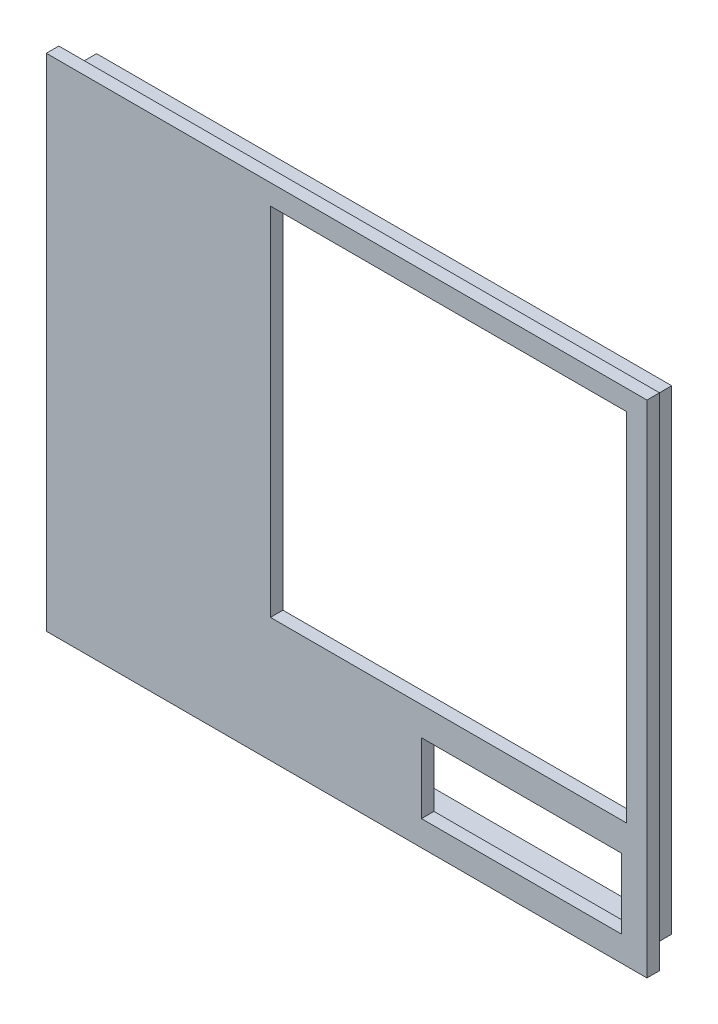
ISO-10303-21;
HEADER;
FILE_DESCRIPTION(('STEP AP214'),'2;1');
FILE_NAME('part.step','',(''),(''),'','','');
FILE_SCHEMA(('AUTOMOTIVE_DESIGN { 1 0 10303 214 1 1 1 1 }'));
ENDSEC;
DATA;
#1=APPLICATION_CONTEXT('core data for automotive mechanical design processes');
#2=APPLICATION_PROTOCOL_DEFINITION('international standard','automotive_design',2000,#1);
#3=PRODUCT_CONTEXT('',#1,'mechanical');
#4=PRODUCT('Part','Part','',(#3));
#5=PRODUCT_RELATED_PRODUCT_CATEGORY('part','',(#4));
#6=PRODUCT_DEFINITION_FORMATION('','',#4);
#7=PRODUCT_DEFINITION_CONTEXT('part definition',#1,'design');
#8=PRODUCT_DEFINITION('design','',#6,#7);
#9=PRODUCT_DEFINITION_SHAPE('','',#8);
#10=(LENGTH_UNIT() NAMED_UNIT(*) SI_UNIT(.MILLI.,.METRE.));
#11=(NAMED_UNIT(*) PLANE_ANGLE_UNIT() SI_UNIT($,.RADIAN.));
#12=(NAMED_UNIT(*) SI_UNIT($,.STERADIAN.) SOLID_ANGLE_UNIT());
#13=UNCERTAINTY_MEASURE_WITH_UNIT(LENGTH_MEASURE(1.E-05),#10,'distance_accuracy_value','');
#14=(GEOMETRIC_REPRESENTATION_CONTEXT(3) GLOBAL_UNCERTAINTY_ASSIGNED_CONTEXT((#13)) GLOBAL_UNIT_ASSIGNED_CONTEXT((#10,
#11,#12)) REPRESENTATION_CONTEXT('',''));
#15=CARTESIAN_POINT('',(0.,0.,0.));
#16=DIRECTION('',(0.,0.,1.));
#17=DIRECTION('',(1.,0.,0.));
#18=AXIS2_PLACEMENT_3D('',#15,#16,#17);
#19=CARTESIAN_POINT('',(60.,-50.,2.5));
#20=DIRECTION('',(-1.,0.,0.));
#21=DIRECTION('',(0.,0.,1.));
#22=AXIS2_PLACEMENT_3D('',#19,#20,#21);
#23=PLANE('',#22);
#24=DIRECTION('',(0.,1.,0.));
#25=VECTOR('',#24,1.);
#26=CARTESIAN_POINT('',(60.,-50.,0.));
#27=LINE('',#26,#25);
#28=CARTESIAN_POINT('',(60.,-50.,0.));
#29=VERTEX_POINT('',#28);
#30=CARTESIAN_POINT('',(60.,50.,0.));
#31=VERTEX_POINT('',#30);
#32=EDGE_CURVE('E291',#29,#31,#27,.T.);
#33=ORIENTED_EDGE('',*,*,#32,.T.);
#34=DIRECTION('',(0.,0.,-1.));
#35=VECTOR('',#34,1.);
#36=CARTESIAN_POINT('',(60.,50.,2.5));
#37=LINE('',#36,#35);
#38=CARTESIAN_POINT('',(60.,50.,2.5));
#39=VERTEX_POINT('',#38);
#40=EDGE_CURVE('E12',#39,#31,#37,.T.);
#41=ORIENTED_EDGE('',*,*,#40,.F.);
#42=DIRECTION('',(0.,1.,0.));
#43=VECTOR('',#42,1.);
#44=CARTESIAN_POINT('',(60.,-50.,2.5));
#45=LINE('',#44,#43);
#46=CARTESIAN_POINT('',(60.,-50.,2.5));
#47=VERTEX_POINT('',#46);
#48=EDGE_CURVE('E300',#47,#39,#45,.T.);
#49=ORIENTED_EDGE('',*,*,#48,.F.);
#50=DIRECTION('',(0.,0.,-1.));
#51=VECTOR('',#50,1.);
#52=CARTESIAN_POINT('',(60.,-50.,2.5));
#53=LINE('',#52,#51);
#54=EDGE_CURVE('E314',#47,#29,#53,.T.);
#55=ORIENTED_EDGE('',*,*,#54,.T.);
#56=EDGE_LOOP('',(#33,#41,#49,#55));
#57=FACE_BOUND('',#56,.T.);
#58=ADVANCED_FACE('F73',(#57),#23,.F.);
#59=CARTESIAN_POINT('',(-60.,50.,2.5));
#60=DIRECTION('',(0.,-1.,0.));
#61=DIRECTION('',(0.,0.,-1.));
#62=AXIS2_PLACEMENT_3D('',#59,#60,#61);
#63=PLANE('',#62);
#64=DIRECTION('',(-1.,0.,0.));
#65=VECTOR('',#64,1.);
#66=CARTESIAN_POINT('',(-60.,50.,0.));
#67=LINE('',#66,#65);
#68=CARTESIAN_POINT('',(-60.,50.,0.));
#69=VERTEX_POINT('',#68);
#70=EDGE_CURVE('E318',#31,#69,#67,.T.);
#71=ORIENTED_EDGE('',*,*,#70,.T.);
#72=DIRECTION('',(0.,0.,-1.));
#73=VECTOR('',#72,1.);
#74=CARTESIAN_POINT('',(-60.,50.,2.5));
#75=LINE('',#74,#73);
#76=CARTESIAN_POINT('',(-60.,50.,2.5));
#77=VERTEX_POINT('',#76);
#78=EDGE_CURVE('E81',#77,#69,#75,.T.);
#79=ORIENTED_EDGE('',*,*,#78,.F.);
#80=DIRECTION('',(-1.,0.,0.));
#81=VECTOR('',#80,1.);
#82=CARTESIAN_POINT('',(-60.,50.,2.5));
#83=LINE('',#82,#81);
#84=EDGE_CURVE('E304',#39,#77,#83,.T.);
#85=ORIENTED_EDGE('',*,*,#84,.F.);
#86=ORIENTED_EDGE('',*,*,#40,.T.);
#87=EDGE_LOOP('',(#71,#79,#85,#86));
#88=FACE_BOUND('',#87,.T.);
#89=ADVANCED_FACE('F354',(#88),#63,.F.);
#90=CARTESIAN_POINT('',(-60.,-50.,2.5));
#91=DIRECTION('',(1.,0.,0.));
#92=DIRECTION('',(0.,0.,-1.));
#93=AXIS2_PLACEMENT_3D('',#90,#91,#92);
#94=PLANE('',#93);
#95=DIRECTION('',(0.,-1.,0.));
#96=VECTOR('',#95,1.);
#97=CARTESIAN_POINT('',(-60.,-50.,0.));
#98=LINE('',#97,#96);
#99=CARTESIAN_POINT('',(-60.,-50.,0.));
#100=VERTEX_POINT('',#99);
#101=EDGE_CURVE('E321',#69,#100,#98,.T.);
#102=ORIENTED_EDGE('',*,*,#101,.T.);
#103=DIRECTION('',(0.,0.,-1.));
#104=VECTOR('',#103,1.);
#105=CARTESIAN_POINT('',(-60.,-50.,2.5));
#106=LINE('',#105,#104);
#107=CARTESIAN_POINT('',(-60.,-50.,2.5));
#108=VERTEX_POINT('',#107);
#109=EDGE_CURVE('E329',#108,#100,#106,.T.);
#110=ORIENTED_EDGE('',*,*,#109,.F.);
#111=DIRECTION('',(0.,-1.,0.));
#112=VECTOR('',#111,1.);
#113=CARTESIAN_POINT('',(-60.,-50.,2.5));
#114=LINE('',#113,#112);
#115=EDGE_CURVE('E308',#77,#108,#114,.T.);
#116=ORIENTED_EDGE('',*,*,#115,.F.);
#117=ORIENTED_EDGE('',*,*,#78,.T.);
#118=EDGE_LOOP('',(#102,#110,#116,#117));
#119=FACE_BOUND('',#118,.T.);
#120=ADVANCED_FACE('F338',(#119),#94,.F.);
#121=CARTESIAN_POINT('',(-60.,-50.,2.5));
#122=DIRECTION('',(0.,1.,0.));
#123=DIRECTION('',(0.,0.,1.));
#124=AXIS2_PLACEMENT_3D('',#121,#122,#123);
#125=PLANE('',#124);
#126=DIRECTION('',(1.,0.,0.));
#127=VECTOR('',#126,1.);
#128=CARTESIAN_POINT('',(-60.,-50.,0.));
#129=LINE('',#128,#127);
#130=EDGE_CURVE('E305',#100,#29,#129,.T.);
#131=ORIENTED_EDGE('',*,*,#130,.T.);
#132=ORIENTED_EDGE('',*,*,#54,.F.);
#133=DIRECTION('',(1.,0.,0.));
#134=VECTOR('',#133,1.);
#135=CARTESIAN_POINT('',(-60.,-50.,2.5));
#136=LINE('',#135,#134);
#137=EDGE_CURVE('E311',#108,#47,#136,.T.);
#138=ORIENTED_EDGE('',*,*,#137,.F.);
#139=ORIENTED_EDGE('',*,*,#109,.T.);
#140=EDGE_LOOP('',(#131,#132,#138,#139));
#141=FACE_BOUND('',#140,.T.);
#142=ADVANCED_FACE('F347',(#141),#125,.F.);
#143=CARTESIAN_POINT('',(0.,0.,2.5));
#144=DIRECTION('',(0.,0.,-1.));
#145=DIRECTION('',(-1.,0.,0.));
#146=AXIS2_PLACEMENT_3D('',#143,#144,#145);
#147=PLANE('',#146);
#148=DIRECTION('',(-1.,0.,0.));
#149=VECTOR('',#148,1.);
#150=CARTESIAN_POINT('',(55.95,45.95,2.5));
#151=LINE('',#150,#149);
#152=CARTESIAN_POINT('',(55.95,45.95,2.5));
#153=VERTEX_POINT('',#152);
#154=CARTESIAN_POINT('',(-15.22,45.95,2.5));
#155=VERTEX_POINT('',#154);
#156=EDGE_CURVE('E432',#153,#155,#151,.T.);
#157=ORIENTED_EDGE('',*,*,#156,.F.);
#158=DIRECTION('',(0.,1.,0.));
#159=VECTOR('',#158,1.);
#160=CARTESIAN_POINT('',(55.95,45.95,2.5));
#161=LINE('',#160,#159);
#162=CARTESIAN_POINT('',(55.95,-25.22,2.5));
#163=VERTEX_POINT('',#162);
#164=EDGE_CURVE('E435',#163,#153,#161,.T.);
#165=ORIENTED_EDGE('',*,*,#164,.F.);
#166=DIRECTION('',(1.,0.,0.));
#167=VECTOR('',#166,1.);
#168=CARTESIAN_POINT('',(55.95,-25.22,2.5));
#169=LINE('',#168,#167);
#170=CARTESIAN_POINT('',(-15.22,-25.22,2.5));
#171=VERTEX_POINT('',#170);
#172=EDGE_CURVE('E207',#171,#163,#169,.T.);
#173=ORIENTED_EDGE('',*,*,#172,.F.);
#174=DIRECTION('',(0.,-1.,0.));
#175=VECTOR('',#174,1.);
#176=CARTESIAN_POINT('',(-15.22,45.95,2.5));
#177=LINE('',#176,#175);
#178=EDGE_CURVE('E428',#155,#171,#177,.T.);
#179=ORIENTED_EDGE('',*,*,#178,.F.);
#180=EDGE_LOOP('',(#157,#165,#173,#179));
#181=FACE_BOUND('',#180,.T.);
#182=DIRECTION('',(1.,0.,0.));
#183=VECTOR('',#182,1.);
#184=CARTESIAN_POINT('',(54.95,-44.95,2.5));
#185=LINE('',#184,#183);
#186=CARTESIAN_POINT('',(14.95,-44.95,2.5));
#187=VERTEX_POINT('',#186);
#188=CARTESIAN_POINT('',(54.95,-44.95,2.5));
#189=VERTEX_POINT('',#188);
#190=EDGE_CURVE('E477',#187,#189,#185,.T.);
#191=ORIENTED_EDGE('',*,*,#190,.F.);
#192=DIRECTION('',(0.,-1.,0.));
#193=VECTOR('',#192,1.);
#194=CARTESIAN_POINT('',(14.95,-44.95,2.5));
#195=LINE('',#194,#193);
#196=CARTESIAN_POINT('',(14.95,-30.95,2.5));
#197=VERTEX_POINT('',#196);
#198=EDGE_CURVE('E448',#197,#187,#195,.T.);
#199=ORIENTED_EDGE('',*,*,#198,.F.);
#200=DIRECTION('',(-1.,0.,0.));
#201=VECTOR('',#200,1.);
#202=CARTESIAN_POINT('',(54.95,-30.95,2.5));
#203=LINE('',#202,#201);
#204=CARTESIAN_POINT('',(54.95,-30.95,2.5));
#205=VERTEX_POINT('',#204);
#206=EDGE_CURVE('E445',#205,#197,#203,.T.);
#207=ORIENTED_EDGE('',*,*,#206,.F.);
#208=DIRECTION('',(0.,1.,0.));
#209=VECTOR('',#208,1.);
#210=CARTESIAN_POINT('',(54.95,-44.95,2.5));
#211=LINE('',#210,#209);
#212=EDGE_CURVE('E462',#189,#205,#211,.T.);
#213=ORIENTED_EDGE('',*,*,#212,.F.);
#214=EDGE_LOOP('',(#191,#199,#207,#213));
#215=FACE_BOUND('',#214,.T.);
#216=ORIENTED_EDGE('',*,*,#48,.T.);
#217=ORIENTED_EDGE('',*,*,#84,.T.);
#218=ORIENTED_EDGE('',*,*,#115,.T.);
#219=ORIENTED_EDGE('',*,*,#137,.T.);
#220=EDGE_LOOP('',(#216,#217,#218,#219));
#221=FACE_BOUND('',#220,.T.);
#222=ADVANCED_FACE('F353',(#181,#215,#221),#147,.F.);
#223=CARTESIAN_POINT('',(0.,0.,0.));
#224=DIRECTION('',(0.,0.,-1.));
#225=DIRECTION('',(-1.,0.,0.));
#226=AXIS2_PLACEMENT_3D('',#223,#224,#225);
#227=PLANE('',#226);
#228=DIRECTION('',(-1.,0.,0.));
#229=VECTOR('',#228,1.);
#230=CARTESIAN_POINT('',(57.45,47.45,0.));
#231=LINE('',#230,#229);
#232=CARTESIAN_POINT('',(57.45,47.45,0.));
#233=VERTEX_POINT('',#232);
#234=CARTESIAN_POINT('',(-57.45,47.45,0.));
#235=VERTEX_POINT('',#234);
#236=EDGE_CURVE('E246',#233,#235,#231,.T.);
#237=ORIENTED_EDGE('',*,*,#236,.T.);
#238=DIRECTION('',(0.,1.,0.));
#239=VECTOR('',#238,1.);
#240=CARTESIAN_POINT('',(-57.45,-47.45,0.));
#241=LINE('',#240,#239);
#242=CARTESIAN_POINT('',(-57.45,-47.45,0.));
#243=VERTEX_POINT('',#242);
#244=EDGE_CURVE('E277',#243,#235,#241,.T.);
#245=ORIENTED_EDGE('',*,*,#244,.F.);
#246=DIRECTION('',(-1.,0.,0.));
#247=VECTOR('',#246,1.);
#248=CARTESIAN_POINT('',(57.45,-47.45,0.));
#249=LINE('',#248,#247);
#250=CARTESIAN_POINT('',(57.45,-47.45,0.));
#251=VERTEX_POINT('',#250);
#252=EDGE_CURVE('E281',#251,#243,#249,.T.);
#253=ORIENTED_EDGE('',*,*,#252,.F.);
#254=DIRECTION('',(0.,1.,0.));
#255=VECTOR('',#254,1.);
#256=CARTESIAN_POINT('',(57.45,-47.45,0.));
#257=LINE('',#256,#255);
#258=EDGE_CURVE('E263',#251,#233,#257,.T.);
#259=ORIENTED_EDGE('',*,*,#258,.T.);
#260=EDGE_LOOP('',(#237,#245,#253,#259));
#261=FACE_BOUND('',#260,.T.);
#262=ORIENTED_EDGE('',*,*,#32,.F.);
#263=ORIENTED_EDGE('',*,*,#130,.F.);
#264=ORIENTED_EDGE('',*,*,#101,.F.);
#265=ORIENTED_EDGE('',*,*,#70,.F.);
#266=EDGE_LOOP('',(#262,#263,#264,#265));
#267=FACE_BOUND('',#266,.T.);
#268=ADVANCED_FACE('F344',(#261,#267),#227,.T.);
#269=CARTESIAN_POINT('',(57.45,47.45,-5.));
#270=DIRECTION('',(0.,1.,0.));
#271=DIRECTION('',(0.,0.,1.));
#272=AXIS2_PLACEMENT_3D('',#269,#270,#271);
#273=PLANE('',#272);
#274=ORIENTED_EDGE('',*,*,#236,.F.);
#275=DIRECTION('',(0.,0.,1.));
#276=VECTOR('',#275,1.);
#277=CARTESIAN_POINT('',(57.45,47.45,-5.));
#278=LINE('',#277,#276);
#279=CARTESIAN_POINT('',(57.45,47.45,-5.));
#280=VERTEX_POINT('',#279);
#281=EDGE_CURVE('E288',#280,#233,#278,.T.);
#282=ORIENTED_EDGE('',*,*,#281,.F.);
#283=DIRECTION('',(-1.,0.,0.));
#284=VECTOR('',#283,1.);
#285=CARTESIAN_POINT('',(57.45,47.45,-5.));
#286=LINE('',#285,#284);
#287=CARTESIAN_POINT('',(-57.45,47.45,-5.));
#288=VERTEX_POINT('',#287);
#289=EDGE_CURVE('E258',#280,#288,#286,.T.);
#290=ORIENTED_EDGE('',*,*,#289,.T.);
#291=DIRECTION('',(0.,0.,1.));
#292=VECTOR('',#291,1.);
#293=CARTESIAN_POINT('',(-57.45,47.45,-5.));
#294=LINE('',#293,#292);
#295=EDGE_CURVE('E273',#288,#235,#294,.T.);
#296=ORIENTED_EDGE('',*,*,#295,.T.);
#297=EDGE_LOOP('',(#274,#282,#290,#296));
#298=FACE_BOUND('',#297,.T.);
#299=ADVANCED_FACE('F366',(#298),#273,.T.);
#300=CARTESIAN_POINT('',(57.45,-47.45,-5.));
#301=DIRECTION('',(1.,0.,0.));
#302=DIRECTION('',(0.,0.,-1.));
#303=AXIS2_PLACEMENT_3D('',#300,#301,#302);
#304=PLANE('',#303);
#305=ORIENTED_EDGE('',*,*,#258,.F.);
#306=DIRECTION('',(0.,0.,1.));
#307=VECTOR('',#306,1.);
#308=CARTESIAN_POINT('',(57.45,-47.45,-5.));
#309=LINE('',#308,#307);
#310=CARTESIAN_POINT('',(57.45,-47.45,-5.));
#311=VERTEX_POINT('',#310);
#312=EDGE_CURVE('E292',#311,#251,#309,.T.);
#313=ORIENTED_EDGE('',*,*,#312,.F.);
#314=DIRECTION('',(0.,1.,0.));
#315=VECTOR('',#314,1.);
#316=CARTESIAN_POINT('',(57.45,-47.45,-5.));
#317=LINE('',#316,#315);
#318=EDGE_CURVE('E269',#311,#280,#317,.T.);
#319=ORIENTED_EDGE('',*,*,#318,.T.);
#320=ORIENTED_EDGE('',*,*,#281,.T.);
#321=EDGE_LOOP('',(#305,#313,#319,#320));
#322=FACE_BOUND('',#321,.T.);
#323=ADVANCED_FACE('F373',(#322),#304,.T.);
#324=CARTESIAN_POINT('',(57.45,-47.45,-5.));
#325=DIRECTION('',(0.,1.,0.));
#326=DIRECTION('',(0.,0.,1.));
#327=AXIS2_PLACEMENT_3D('',#324,#325,#326);
#328=PLANE('',#327);
#329=ORIENTED_EDGE('',*,*,#252,.T.);
#330=DIRECTION('',(0.,0.,1.));
#331=VECTOR('',#330,1.);
#332=CARTESIAN_POINT('',(-57.45,-47.45,-5.));
#333=LINE('',#332,#331);
#334=CARTESIAN_POINT('',(-57.45,-47.45,-5.));
#335=VERTEX_POINT('',#334);
#336=EDGE_CURVE('E295',#335,#243,#333,.T.);
#337=ORIENTED_EDGE('',*,*,#336,.F.);
#338=DIRECTION('',(-1.,0.,0.));
#339=VECTOR('',#338,1.);
#340=CARTESIAN_POINT('',(57.45,-47.45,-5.));
#341=LINE('',#340,#339);
#342=EDGE_CURVE('E266',#311,#335,#341,.T.);
#343=ORIENTED_EDGE('',*,*,#342,.F.);
#344=ORIENTED_EDGE('',*,*,#312,.T.);
#345=EDGE_LOOP('',(#329,#337,#343,#344));
#346=FACE_BOUND('',#345,.T.);
#347=ADVANCED_FACE('F379',(#346),#328,.F.);
#348=CARTESIAN_POINT('',(-57.45,-47.45,-5.));
#349=DIRECTION('',(1.,0.,0.));
#350=DIRECTION('',(0.,0.,-1.));
#351=AXIS2_PLACEMENT_3D('',#348,#349,#350);
#352=PLANE('',#351);
#353=ORIENTED_EDGE('',*,*,#244,.T.);
#354=ORIENTED_EDGE('',*,*,#295,.F.);
#355=DIRECTION('',(0.,1.,0.));
#356=VECTOR('',#355,1.);
#357=CARTESIAN_POINT('',(-57.45,-47.45,-5.));
#358=LINE('',#357,#356);
#359=EDGE_CURVE('E262',#335,#288,#358,.T.);
#360=ORIENTED_EDGE('',*,*,#359,.F.);
#361=ORIENTED_EDGE('',*,*,#336,.T.);
#362=EDGE_LOOP('',(#353,#354,#360,#361));
#363=FACE_BOUND('',#362,.T.);
#364=ADVANCED_FACE('F375',(#363),#352,.F.);
#365=CARTESIAN_POINT('',(0.,0.,-5.));
#366=DIRECTION('',(0.,0.,-1.));
#367=DIRECTION('',(-1.,0.,0.));
#368=AXIS2_PLACEMENT_3D('',#365,#366,#367);
#369=PLANE('',#368);
#370=DIRECTION('',(-1.,0.,0.));
#371=VECTOR('',#370,1.);
#372=CARTESIAN_POINT('',(55.95,45.95,-5.));
#373=LINE('',#372,#371);
#374=CARTESIAN_POINT('',(55.95,45.95,-5.));
#375=VERTEX_POINT('',#374);
#376=CARTESIAN_POINT('',(-55.95,45.95,-5.));
#377=VERTEX_POINT('',#376);
#378=EDGE_CURVE('E231',#375,#377,#373,.T.);
#379=ORIENTED_EDGE('',*,*,#378,.T.);
#380=DIRECTION('',(0.,1.,0.));
#381=VECTOR('',#380,1.);
#382=CARTESIAN_POINT('',(-55.95,-45.95,-5.));
#383=LINE('',#382,#381);
#384=CARTESIAN_POINT('',(-55.95,-45.95,-5.));
#385=VERTEX_POINT('',#384);
#386=EDGE_CURVE('E237',#385,#377,#383,.T.);
#387=ORIENTED_EDGE('',*,*,#386,.F.);
#388=DIRECTION('',(-1.,0.,0.));
#389=VECTOR('',#388,1.);
#390=CARTESIAN_POINT('',(55.95,-45.95,-5.));
#391=LINE('',#390,#389);
#392=CARTESIAN_POINT('',(55.95,-45.95,-5.));
#393=VERTEX_POINT('',#392);
#394=EDGE_CURVE('E484',#393,#385,#391,.T.);
#395=ORIENTED_EDGE('',*,*,#394,.F.);
#396=DIRECTION('',(0.,1.,0.));
#397=VECTOR('',#396,1.);
#398=CARTESIAN_POINT('',(55.95,-45.95,-5.));
#399=LINE('',#398,#397);
#400=EDGE_CURVE('E257',#393,#375,#399,.T.);
#401=ORIENTED_EDGE('',*,*,#400,.T.);
#402=EDGE_LOOP('',(#379,#387,#395,#401));
#403=FACE_BOUND('',#402,.T.);
#404=ORIENTED_EDGE('',*,*,#289,.F.);
#405=ORIENTED_EDGE('',*,*,#318,.F.);
#406=ORIENTED_EDGE('',*,*,#342,.T.);
#407=ORIENTED_EDGE('',*,*,#359,.T.);
#408=EDGE_LOOP('',(#404,#405,#406,#407));
#409=FACE_BOUND('',#408,.T.);
#410=ADVANCED_FACE('F378',(#403,#409),#369,.T.);
#411=CARTESIAN_POINT('',(55.95,45.95,-5.));
#412=DIRECTION('',(0.,1.,0.));
#413=DIRECTION('',(0.,0.,1.));
#414=AXIS2_PLACEMENT_3D('',#411,#412,#413);
#415=PLANE('',#414);
#416=DIRECTION('',(0.,0.,1.));
#417=VECTOR('',#416,1.);
#418=CARTESIAN_POINT('',(55.95,45.95,-5.));
#419=LINE('',#418,#417);
#420=EDGE_CURVE('E243',#375,#153,#419,.T.);
#421=ORIENTED_EDGE('',*,*,#420,.T.);
#422=ORIENTED_EDGE('',*,*,#156,.T.);
#423=DIRECTION('',(0.,0.,-1.));
#424=VECTOR('',#423,1.);
#425=CARTESIAN_POINT('',(-15.22,45.95,103.149579234093));
#426=LINE('',#425,#424);
#427=CARTESIAN_POINT('',(-15.22,45.95,0.));
#428=VERTEX_POINT('',#427);
#429=EDGE_CURVE('E429',#155,#428,#426,.T.);
#430=ORIENTED_EDGE('',*,*,#429,.T.);
#431=DIRECTION('',(-1.,0.,0.));
#432=VECTOR('',#431,1.);
#433=CARTESIAN_POINT('',(55.95,45.95,0.));
#434=LINE('',#433,#432);
#435=CARTESIAN_POINT('',(-55.95,45.95,0.));
#436=VERTEX_POINT('',#435);
#437=EDGE_CURVE('E437',#428,#436,#434,.T.);
#438=ORIENTED_EDGE('',*,*,#437,.T.);
#439=DIRECTION('',(0.,0.,1.));
#440=VECTOR('',#439,1.);
#441=CARTESIAN_POINT('',(-55.95,45.95,-5.));
#442=LINE('',#441,#440);
#443=EDGE_CURVE('E253',#377,#436,#442,.T.);
#444=ORIENTED_EDGE('',*,*,#443,.F.);
#445=ORIENTED_EDGE('',*,*,#378,.F.);
#446=EDGE_LOOP('',(#421,#422,#430,#438,#444,#445));
#447=FACE_BOUND('',#446,.T.);
#448=ADVANCED_FACE('F389',(#447),#415,.F.);
#449=CARTESIAN_POINT('',(55.95,-45.95,-5.));
#450=DIRECTION('',(1.,0.,0.));
#451=DIRECTION('',(0.,0.,-1.));
#452=AXIS2_PLACEMENT_3D('',#449,#450,#451);
#453=PLANE('',#452);
#454=DIRECTION('',(0.,1.,0.));
#455=VECTOR('',#454,1.);
#456=CARTESIAN_POINT('',(55.95,-45.95,0.));
#457=LINE('',#456,#455);
#458=CARTESIAN_POINT('',(55.95,-45.95,0.));
#459=VERTEX_POINT('',#458);
#460=CARTESIAN_POINT('',(55.95,-25.22,0.));
#461=VERTEX_POINT('',#460);
#462=EDGE_CURVE('E219',#459,#461,#457,.T.);
#463=ORIENTED_EDGE('',*,*,#462,.T.);
#464=DIRECTION('',(0.,0.,-1.));
#465=VECTOR('',#464,1.);
#466=CARTESIAN_POINT('',(55.95,-25.22,103.149579234093));
#467=LINE('',#466,#465);
#468=EDGE_CURVE('E202',#163,#461,#467,.T.);
#469=ORIENTED_EDGE('',*,*,#468,.F.);
#470=ORIENTED_EDGE('',*,*,#164,.T.);
#471=ORIENTED_EDGE('',*,*,#420,.F.);
#472=ORIENTED_EDGE('',*,*,#400,.F.);
#473=DIRECTION('',(0.,0.,1.));
#474=VECTOR('',#473,1.);
#475=CARTESIAN_POINT('',(55.95,-45.95,-5.));
#476=LINE('',#475,#474);
#477=EDGE_CURVE('E228',#393,#459,#476,.T.);
#478=ORIENTED_EDGE('',*,*,#477,.T.);
#479=EDGE_LOOP('',(#463,#469,#470,#471,#472,#478));
#480=FACE_BOUND('',#479,.T.);
#481=ADVANCED_FACE('F226',(#480),#453,.F.);
#482=CARTESIAN_POINT('',(55.95,-45.95,-5.));
#483=DIRECTION('',(0.,1.,0.));
#484=DIRECTION('',(0.,0.,1.));
#485=AXIS2_PLACEMENT_3D('',#482,#483,#484);
#486=PLANE('',#485);
#487=DIRECTION('',(-1.,0.,0.));
#488=VECTOR('',#487,1.);
#489=CARTESIAN_POINT('',(55.95,-45.95,0.));
#490=LINE('',#489,#488);
#491=CARTESIAN_POINT('',(-55.95,-45.95,0.));
#492=VERTEX_POINT('',#491);
#493=EDGE_CURVE('E232',#459,#492,#490,.T.);
#494=ORIENTED_EDGE('',*,*,#493,.F.);
#495=ORIENTED_EDGE('',*,*,#477,.F.);
#496=ORIENTED_EDGE('',*,*,#394,.T.);
#497=DIRECTION('',(0.,0.,1.));
#498=VECTOR('',#497,1.);
#499=CARTESIAN_POINT('',(-55.95,-45.95,-5.));
#500=LINE('',#499,#498);
#501=EDGE_CURVE('E249',#385,#492,#500,.T.);
#502=ORIENTED_EDGE('',*,*,#501,.T.);
#503=EDGE_LOOP('',(#494,#495,#496,#502));
#504=FACE_BOUND('',#503,.T.);
#505=ADVANCED_FACE('F397',(#504),#486,.T.);
#506=CARTESIAN_POINT('',(-55.95,-45.95,-5.));
#507=DIRECTION('',(1.,0.,0.));
#508=DIRECTION('',(0.,0.,-1.));
#509=AXIS2_PLACEMENT_3D('',#506,#507,#508);
#510=PLANE('',#509);
#511=DIRECTION('',(0.,1.,0.));
#512=VECTOR('',#511,1.);
#513=CARTESIAN_POINT('',(-55.95,-45.95,0.));
#514=LINE('',#513,#512);
#515=EDGE_CURVE('E239',#492,#436,#514,.T.);
#516=ORIENTED_EDGE('',*,*,#515,.F.);
#517=ORIENTED_EDGE('',*,*,#501,.F.);
#518=ORIENTED_EDGE('',*,*,#386,.T.);
#519=ORIENTED_EDGE('',*,*,#443,.T.);
#520=EDGE_LOOP('',(#516,#517,#518,#519));
#521=FACE_BOUND('',#520,.T.);
#522=ADVANCED_FACE('F394',(#521),#510,.T.);
#523=DIRECTION('',(-1.,0.,0.));
#524=VECTOR('',#523,1.);
#525=CARTESIAN_POINT('',(55.95,-25.22,0.));
#526=LINE('',#525,#524);
#527=CARTESIAN_POINT('',(-15.22,-25.22,0.));
#528=VERTEX_POINT('',#527);
#529=EDGE_CURVE('E205',#461,#528,#526,.T.);
#530=ORIENTED_EDGE('',*,*,#529,.F.);
#531=ORIENTED_EDGE('',*,*,#462,.F.);
#532=ORIENTED_EDGE('',*,*,#493,.T.);
#533=ORIENTED_EDGE('',*,*,#515,.T.);
#534=ORIENTED_EDGE('',*,*,#437,.F.);
#535=DIRECTION('',(0.,1.,0.));
#536=VECTOR('',#535,1.);
#537=CARTESIAN_POINT('',(-15.22,45.95,0.));
#538=LINE('',#537,#536);
#539=EDGE_CURVE('E213',#528,#428,#538,.T.);
#540=ORIENTED_EDGE('',*,*,#539,.F.);
#541=EDGE_LOOP('',(#530,#531,#532,#533,#534,#540));
#542=FACE_BOUND('',#541,.T.);
#543=DIRECTION('',(0.,1.,0.));
#544=VECTOR('',#543,1.);
#545=CARTESIAN_POINT('',(14.95,-44.95,0.));
#546=LINE('',#545,#544);
#547=CARTESIAN_POINT('',(14.95,-44.95,0.));
#548=VERTEX_POINT('',#547);
#549=CARTESIAN_POINT('',(14.95,-30.95,0.));
#550=VERTEX_POINT('',#549);
#551=EDGE_CURVE('E224',#548,#550,#546,.T.);
#552=ORIENTED_EDGE('',*,*,#551,.F.);
#553=DIRECTION('',(-1.,0.,0.));
#554=VECTOR('',#553,1.);
#555=CARTESIAN_POINT('',(54.95,-44.95,0.));
#556=LINE('',#555,#554);
#557=CARTESIAN_POINT('',(54.95,-44.95,0.));
#558=VERTEX_POINT('',#557);
#559=EDGE_CURVE('E453',#558,#548,#556,.T.);
#560=ORIENTED_EDGE('',*,*,#559,.F.);
#561=DIRECTION('',(0.,-1.,0.));
#562=VECTOR('',#561,1.);
#563=CARTESIAN_POINT('',(54.95,-44.95,0.));
#564=LINE('',#563,#562);
#565=CARTESIAN_POINT('',(54.95,-30.95,0.));
#566=VERTEX_POINT('',#565);
#567=EDGE_CURVE('E466',#566,#558,#564,.T.);
#568=ORIENTED_EDGE('',*,*,#567,.F.);
#569=DIRECTION('',(1.,0.,0.));
#570=VECTOR('',#569,1.);
#571=CARTESIAN_POINT('',(54.95,-30.95,0.));
#572=LINE('',#571,#570);
#573=EDGE_CURVE('E470',#550,#566,#572,.T.);
#574=ORIENTED_EDGE('',*,*,#573,.F.);
#575=EDGE_LOOP('',(#552,#560,#568,#574));
#576=FACE_BOUND('',#575,.T.);
#577=ADVANCED_FACE('F217',(#542,#576),#227,.T.);
#578=CARTESIAN_POINT('',(14.95,-44.95,103.149579234093));
#579=DIRECTION('',(-1.,0.,0.));
#580=DIRECTION('',(0.,0.,1.));
#581=AXIS2_PLACEMENT_3D('',#578,#579,#580);
#582=PLANE('',#581);
#583=ORIENTED_EDGE('',*,*,#198,.T.);
#584=DIRECTION('',(0.,0.,-1.));
#585=VECTOR('',#584,1.);
#586=CARTESIAN_POINT('',(14.95,-44.95,103.149579234093));
#587=LINE('',#586,#585);
#588=EDGE_CURVE('E459',#187,#548,#587,.T.);
#589=ORIENTED_EDGE('',*,*,#588,.T.);
#590=ORIENTED_EDGE('',*,*,#551,.T.);
#591=DIRECTION('',(0.,0.,-1.));
#592=VECTOR('',#591,1.);
#593=CARTESIAN_POINT('',(14.95,-30.95,103.149579234093));
#594=LINE('',#593,#592);
#595=EDGE_CURVE('E449',#197,#550,#594,.T.);
#596=ORIENTED_EDGE('',*,*,#595,.F.);
#597=EDGE_LOOP('',(#583,#589,#590,#596));
#598=FACE_BOUND('',#597,.T.);
#599=ADVANCED_FACE('F408',(#598),#582,.F.);
#600=CARTESIAN_POINT('',(54.95,-44.95,103.149579234093));
#601=DIRECTION('',(0.,-1.,0.));
#602=DIRECTION('',(0.,0.,-1.));
#603=AXIS2_PLACEMENT_3D('',#600,#601,#602);
#604=PLANE('',#603);
#605=ORIENTED_EDGE('',*,*,#190,.T.);
#606=DIRECTION('',(0.,0.,-1.));
#607=VECTOR('',#606,1.);
#608=CARTESIAN_POINT('',(54.95,-44.95,103.149579234093));
#609=LINE('',#608,#607);
#610=EDGE_CURVE('E456',#189,#558,#609,.T.);
#611=ORIENTED_EDGE('',*,*,#610,.T.);
#612=ORIENTED_EDGE('',*,*,#559,.T.);
#613=ORIENTED_EDGE('',*,*,#588,.F.);
#614=EDGE_LOOP('',(#605,#611,#612,#613));
#615=FACE_BOUND('',#614,.T.);
#616=ADVANCED_FACE('F404',(#615),#604,.F.);
#617=CARTESIAN_POINT('',(54.95,-44.95,103.149579234093));
#618=DIRECTION('',(1.,0.,0.));
#619=DIRECTION('',(0.,0.,-1.));
#620=AXIS2_PLACEMENT_3D('',#617,#618,#619);
#621=PLANE('',#620);
#622=ORIENTED_EDGE('',*,*,#212,.T.);
#623=DIRECTION('',(0.,0.,-1.));
#624=VECTOR('',#623,1.);
#625=CARTESIAN_POINT('',(54.95,-30.95,103.149579234093));
#626=LINE('',#625,#624);
#627=EDGE_CURVE('E96',#205,#566,#626,.T.);
#628=ORIENTED_EDGE('',*,*,#627,.T.);
#629=ORIENTED_EDGE('',*,*,#567,.T.);
#630=ORIENTED_EDGE('',*,*,#610,.F.);
#631=EDGE_LOOP('',(#622,#628,#629,#630));
#632=FACE_BOUND('',#631,.T.);
#633=ADVANCED_FACE('F407',(#632),#621,.F.);
#634=CARTESIAN_POINT('',(54.95,-30.95,103.149579234093));
#635=DIRECTION('',(0.,1.,0.));
#636=DIRECTION('',(0.,0.,1.));
#637=AXIS2_PLACEMENT_3D('',#634,#635,#636);
#638=PLANE('',#637);
#639=ORIENTED_EDGE('',*,*,#206,.T.);
#640=ORIENTED_EDGE('',*,*,#595,.T.);
#641=ORIENTED_EDGE('',*,*,#573,.T.);
#642=ORIENTED_EDGE('',*,*,#627,.F.);
#643=EDGE_LOOP('',(#639,#640,#641,#642));
#644=FACE_BOUND('',#643,.T.);
#645=ADVANCED_FACE('F412',(#644),#638,.F.);
#646=CARTESIAN_POINT('',(-15.22,45.95,103.149579234093));
#647=DIRECTION('',(-1.,0.,0.));
#648=DIRECTION('',(0.,-1.,0.));
#649=AXIS2_PLACEMENT_3D('',#646,#647,#648);
#650=PLANE('',#649);
#651=ORIENTED_EDGE('',*,*,#178,.T.);
#652=DIRECTION('',(0.,0.,-1.));
#653=VECTOR('',#652,1.);
#654=CARTESIAN_POINT('',(-15.22,-25.22,103.149579234093));
#655=LINE('',#654,#653);
#656=EDGE_CURVE('E88',#171,#528,#655,.T.);
#657=ORIENTED_EDGE('',*,*,#656,.T.);
#658=ORIENTED_EDGE('',*,*,#539,.T.);
#659=ORIENTED_EDGE('',*,*,#429,.F.);
#660=EDGE_LOOP('',(#651,#657,#658,#659));
#661=FACE_BOUND('',#660,.T.);
#662=ADVANCED_FACE('F416',(#661),#650,.F.);
#663=CARTESIAN_POINT('',(55.95,-25.22,103.149579234093));
#664=DIRECTION('',(0.,-1.,0.));
#665=DIRECTION('',(0.,0.,-1.));
#666=AXIS2_PLACEMENT_3D('',#663,#664,#665);
#667=PLANE('',#666);
#668=ORIENTED_EDGE('',*,*,#172,.T.);
#669=ORIENTED_EDGE('',*,*,#468,.T.);
#670=ORIENTED_EDGE('',*,*,#529,.T.);
#671=ORIENTED_EDGE('',*,*,#656,.F.);
#672=EDGE_LOOP('',(#668,#669,#670,#671));
#673=FACE_BOUND('',#672,.T.);
#674=ADVANCED_FACE('F204',(#673),#667,.F.);
#675=CLOSED_SHELL('',(#58,#89,#120,#142,#222,#268,#299,#323,#347,#364,#410,#448,#481,#505,#522,
#577,#599,#616,#633,#645,#662,#674));
#676=MANIFOLD_SOLID_BREP('B2',#675);
#677=ADVANCED_BREP_SHAPE_REPRESENTATION('',(#18,#676),#14);
#678=SHAPE_DEFINITION_REPRESENTATION(#9,#677);
ENDSEC;
END-ISO-10303-21;
